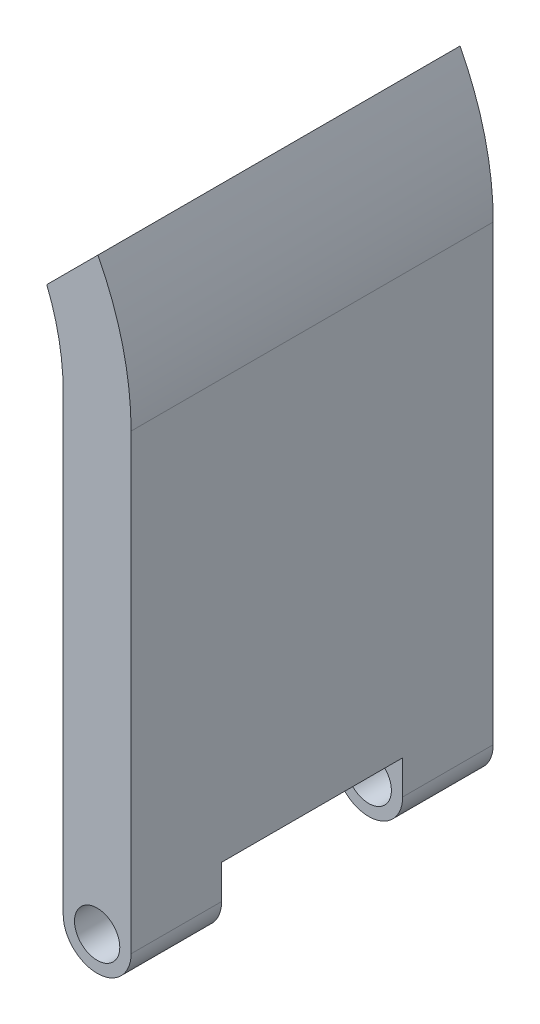
ISO-10303-21;
HEADER;
FILE_DESCRIPTION(('STEP AP214'),'2;1');
FILE_NAME('part.step','',(''),(''),'','','');
FILE_SCHEMA(('AUTOMOTIVE_DESIGN { 1 0 10303 214 1 1 1 1 }'));
ENDSEC;
DATA;
#1=APPLICATION_CONTEXT('core data for automotive mechanical design processes');
#2=APPLICATION_PROTOCOL_DEFINITION('international standard','automotive_design',2000,#1);
#3=PRODUCT_CONTEXT('',#1,'mechanical');
#4=PRODUCT('Part','Part','',(#3));
#5=PRODUCT_RELATED_PRODUCT_CATEGORY('part','',(#4));
#6=PRODUCT_DEFINITION_FORMATION('','',#4);
#7=PRODUCT_DEFINITION_CONTEXT('part definition',#1,'design');
#8=PRODUCT_DEFINITION('design','',#6,#7);
#9=PRODUCT_DEFINITION_SHAPE('','',#8);
#10=(LENGTH_UNIT() NAMED_UNIT(*) SI_UNIT(.MILLI.,.METRE.));
#11=(NAMED_UNIT(*) PLANE_ANGLE_UNIT() SI_UNIT($,.RADIAN.));
#12=(NAMED_UNIT(*) SI_UNIT($,.STERADIAN.) SOLID_ANGLE_UNIT());
#13=UNCERTAINTY_MEASURE_WITH_UNIT(LENGTH_MEASURE(1.E-05),#10,'distance_accuracy_value','');
#14=(GEOMETRIC_REPRESENTATION_CONTEXT(3) GLOBAL_UNCERTAINTY_ASSIGNED_CONTEXT((#13)) GLOBAL_UNIT_ASSIGNED_CONTEXT((#10,
#11,#12)) REPRESENTATION_CONTEXT('',''));
#15=CARTESIAN_POINT('',(0.,0.,0.));
#16=DIRECTION('',(0.,0.,1.));
#17=DIRECTION('',(1.,0.,0.));
#18=AXIS2_PLACEMENT_3D('',#15,#16,#17);
#19=CARTESIAN_POINT('',(-1.5,0.,16.));
#20=DIRECTION('',(0.,0.,-1.));
#21=DIRECTION('',(-1.,0.,0.));
#22=AXIS2_PLACEMENT_3D('',#19,#20,#21);
#23=CYLINDRICAL_SURFACE('',#22,1.5);
#24=CARTESIAN_POINT('',(-1.5,0.,12.));
#25=DIRECTION('',(0.,0.,-1.));
#26=DIRECTION('',(-1.,0.,0.));
#27=AXIS2_PLACEMENT_3D('',#24,#25,#26);
#28=CIRCLE('',#27,1.5);
#29=CARTESIAN_POINT('',(0.,0.,12.));
#30=VERTEX_POINT('',#29);
#31=CARTESIAN_POINT('',(-3.,0.,12.));
#32=VERTEX_POINT('',#31);
#33=EDGE_CURVE('E226',#30,#32,#28,.T.);
#34=ORIENTED_EDGE('',*,*,#33,.F.);
#35=DIRECTION('',(0.,0.,-1.));
#36=VECTOR('',#35,1.);
#37=CARTESIAN_POINT('',(0.,0.,16.));
#38=LINE('',#37,#36);
#39=CARTESIAN_POINT('',(0.,0.,16.));
#40=VERTEX_POINT('',#39);
#41=EDGE_CURVE('E164',#40,#30,#38,.T.);
#42=ORIENTED_EDGE('',*,*,#41,.F.);
#43=CARTESIAN_POINT('',(-1.5,0.,16.));
#44=DIRECTION('',(0.,0.,1.));
#45=DIRECTION('',(1.,0.,0.));
#46=AXIS2_PLACEMENT_3D('',#43,#44,#45);
#47=CIRCLE('',#46,1.5);
#48=CARTESIAN_POINT('',(-3.,0.,16.));
#49=VERTEX_POINT('',#48);
#50=EDGE_CURVE('E209',#49,#40,#47,.T.);
#51=ORIENTED_EDGE('',*,*,#50,.F.);
#52=DIRECTION('',(0.,0.,-1.));
#53=VECTOR('',#52,1.);
#54=CARTESIAN_POINT('',(-3.,0.,16.));
#55=LINE('',#54,#53);
#56=EDGE_CURVE('E160',#49,#32,#55,.T.);
#57=ORIENTED_EDGE('',*,*,#56,.T.);
#58=EDGE_LOOP('',(#34,#42,#51,#57));
#59=FACE_BOUND('',#58,.T.);
#60=ADVANCED_FACE('F43',(#59),#23,.T.);
#61=CARTESIAN_POINT('',(-1.5,0.,16.));
#62=DIRECTION('',(0.,0.,-1.));
#63=DIRECTION('',(-1.,0.,0.));
#64=AXIS2_PLACEMENT_3D('',#61,#62,#63);
#65=CYLINDRICAL_SURFACE('',#64,1.);
#66=CARTESIAN_POINT('',(-1.5,0.,16.));
#67=DIRECTION('',(0.,0.,1.));
#68=DIRECTION('',(1.,0.,0.));
#69=AXIS2_PLACEMENT_3D('',#66,#67,#68);
#70=CIRCLE('',#69,1.);
#71=CARTESIAN_POINT('',(-0.5,0.,16.));
#72=VERTEX_POINT('',#71);
#73=EDGE_CURVE('E181',#72,#72,#70,.T.);
#74=ORIENTED_EDGE('',*,*,#73,.T.);
#75=EDGE_LOOP('',(#74));
#76=FACE_BOUND('',#75,.T.);
#77=CARTESIAN_POINT('',(-1.5,0.,12.));
#78=DIRECTION('',(0.,0.,-1.));
#79=DIRECTION('',(-1.,0.,0.));
#80=AXIS2_PLACEMENT_3D('',#77,#78,#79);
#81=CIRCLE('',#80,1.);
#82=CARTESIAN_POINT('',(-2.5,0.,12.));
#83=VERTEX_POINT('',#82);
#84=EDGE_CURVE('E220',#83,#83,#81,.T.);
#85=ORIENTED_EDGE('',*,*,#84,.T.);
#86=EDGE_LOOP('',(#85));
#87=FACE_BOUND('',#86,.T.);
#88=ADVANCED_FACE('F272',(#76,#87),#65,.F.);
#89=CARTESIAN_POINT('',(-3.,0.,16.));
#90=DIRECTION('',(-1.,0.,0.));
#91=DIRECTION('',(0.,0.,1.));
#92=AXIS2_PLACEMENT_3D('',#89,#90,#91);
#93=PLANE('',#92);
#94=DIRECTION('',(0.,-1.,0.));
#95=VECTOR('',#94,1.);
#96=CARTESIAN_POINT('',(-3.,0.,4.));
#97=LINE('',#96,#95);
#98=CARTESIAN_POINT('',(-3.,1.5,4.));
#99=VERTEX_POINT('',#98);
#100=CARTESIAN_POINT('',(-3.,0.,4.));
#101=VERTEX_POINT('',#100);
#102=EDGE_CURVE('E234',#99,#101,#97,.T.);
#103=ORIENTED_EDGE('',*,*,#102,.F.);
#104=DIRECTION('',(0.,0.,1.));
#105=VECTOR('',#104,1.);
#106=CARTESIAN_POINT('',(-3.,1.5,4.));
#107=LINE('',#106,#105);
#108=CARTESIAN_POINT('',(-3.,1.5,12.));
#109=VERTEX_POINT('',#108);
#110=EDGE_CURVE('E148',#99,#109,#107,.T.);
#111=ORIENTED_EDGE('',*,*,#110,.T.);
#112=DIRECTION('',(0.,-1.,0.));
#113=VECTOR('',#112,1.);
#114=CARTESIAN_POINT('',(-3.,0.,12.));
#115=LINE('',#114,#113);
#116=EDGE_CURVE('E223',#109,#32,#115,.T.);
#117=ORIENTED_EDGE('',*,*,#116,.T.);
#118=ORIENTED_EDGE('',*,*,#56,.F.);
#119=DIRECTION('',(0.,1.,0.));
#120=VECTOR('',#119,1.);
#121=CARTESIAN_POINT('',(-3.,0.,16.));
#122=LINE('',#121,#120);
#123=CARTESIAN_POINT('',(-3.,20.,16.));
#124=VERTEX_POINT('',#123);
#125=EDGE_CURVE('E212',#49,#124,#122,.T.);
#126=ORIENTED_EDGE('',*,*,#125,.T.);
#127=DIRECTION('',(0.,0.,-1.));
#128=VECTOR('',#127,1.);
#129=CARTESIAN_POINT('',(-3.,20.,16.));
#130=LINE('',#129,#128);
#131=CARTESIAN_POINT('',(-3.,20.,0.));
#132=VERTEX_POINT('',#131);
#133=EDGE_CURVE('E175',#124,#132,#130,.T.);
#134=ORIENTED_EDGE('',*,*,#133,.T.);
#135=DIRECTION('',(0.,1.,0.));
#136=VECTOR('',#135,1.);
#137=CARTESIAN_POINT('',(-3.,0.,0.));
#138=LINE('',#137,#136);
#139=CARTESIAN_POINT('',(-3.,0.,0.));
#140=VERTEX_POINT('',#139);
#141=EDGE_CURVE('E194',#140,#132,#138,.T.);
#142=ORIENTED_EDGE('',*,*,#141,.F.);
#143=EDGE_CURVE('E163',#101,#140,#55,.T.);
#144=ORIENTED_EDGE('',*,*,#143,.F.);
#145=EDGE_LOOP('',(#103,#111,#117,#118,#126,#134,#142,#144));
#146=FACE_BOUND('',#145,.T.);
#147=ADVANCED_FACE('F244',(#146),#93,.T.);
#148=CARTESIAN_POINT('',(0.,0.,4.));
#149=VERTEX_POINT('',#148);
#150=CARTESIAN_POINT('',(0.,0.,0.));
#151=VERTEX_POINT('',#150);
#152=EDGE_CURVE('E166',#149,#151,#38,.T.);
#153=ORIENTED_EDGE('',*,*,#152,.F.);
#154=CARTESIAN_POINT('',(-1.5,0.,4.));
#155=DIRECTION('',(0.,0.,-1.));
#156=DIRECTION('',(-1.,0.,0.));
#157=AXIS2_PLACEMENT_3D('',#154,#155,#156);
#158=CIRCLE('',#157,1.5);
#159=EDGE_CURVE('E135',#149,#101,#158,.T.);
#160=ORIENTED_EDGE('',*,*,#159,.T.);
#161=ORIENTED_EDGE('',*,*,#143,.T.);
#162=CARTESIAN_POINT('',(-1.5,0.,0.));
#163=DIRECTION('',(0.,0.,1.));
#164=DIRECTION('',(1.,0.,0.));
#165=AXIS2_PLACEMENT_3D('',#162,#163,#164);
#166=CIRCLE('',#165,1.5);
#167=EDGE_CURVE('E191',#140,#151,#166,.T.);
#168=ORIENTED_EDGE('',*,*,#167,.T.);
#169=EDGE_LOOP('',(#153,#160,#161,#168));
#170=FACE_BOUND('',#169,.T.);
#171=ADVANCED_FACE('F248',(#170),#23,.T.);
#172=CARTESIAN_POINT('',(0.,0.,16.));
#173=DIRECTION('',(-1.,0.,0.));
#174=DIRECTION('',(0.,0.,1.));
#175=AXIS2_PLACEMENT_3D('',#172,#173,#174);
#176=PLANE('',#175);
#177=DIRECTION('',(0.,0.,1.));
#178=VECTOR('',#177,1.);
#179=CARTESIAN_POINT('',(0.,1.5,4.));
#180=LINE('',#179,#178);
#181=CARTESIAN_POINT('',(0.,1.5,4.));
#182=VERTEX_POINT('',#181);
#183=CARTESIAN_POINT('',(0.,1.5,12.));
#184=VERTEX_POINT('',#183);
#185=EDGE_CURVE('E142',#182,#184,#180,.T.);
#186=ORIENTED_EDGE('',*,*,#185,.F.);
#187=DIRECTION('',(0.,1.,0.));
#188=VECTOR('',#187,1.);
#189=CARTESIAN_POINT('',(0.,0.,4.));
#190=LINE('',#189,#188);
#191=EDGE_CURVE('E130',#149,#182,#190,.T.);
#192=ORIENTED_EDGE('',*,*,#191,.F.);
#193=ORIENTED_EDGE('',*,*,#152,.T.);
#194=DIRECTION('',(0.,1.,0.));
#195=VECTOR('',#194,1.);
#196=CARTESIAN_POINT('',(0.,0.,0.));
#197=LINE('',#196,#195);
#198=CARTESIAN_POINT('',(0.,20.,0.));
#199=VERTEX_POINT('',#198);
#200=EDGE_CURVE('E188',#151,#199,#197,.T.);
#201=ORIENTED_EDGE('',*,*,#200,.T.);
#202=DIRECTION('',(0.,0.,-1.));
#203=VECTOR('',#202,1.);
#204=CARTESIAN_POINT('',(0.,20.,16.));
#205=LINE('',#204,#203);
#206=CARTESIAN_POINT('',(0.,20.,16.));
#207=VERTEX_POINT('',#206);
#208=EDGE_CURVE('E167',#207,#199,#205,.T.);
#209=ORIENTED_EDGE('',*,*,#208,.F.);
#210=DIRECTION('',(0.,1.,0.));
#211=VECTOR('',#210,1.);
#212=CARTESIAN_POINT('',(0.,0.,16.));
#213=LINE('',#212,#211);
#214=EDGE_CURVE('E206',#40,#207,#213,.T.);
#215=ORIENTED_EDGE('',*,*,#214,.F.);
#216=ORIENTED_EDGE('',*,*,#41,.T.);
#217=DIRECTION('',(0.,1.,0.));
#218=VECTOR('',#217,1.);
#219=CARTESIAN_POINT('',(0.,0.,12.));
#220=LINE('',#219,#218);
#221=EDGE_CURVE('E145',#30,#184,#220,.T.);
#222=ORIENTED_EDGE('',*,*,#221,.T.);
#223=EDGE_LOOP('',(#186,#192,#193,#201,#209,#215,#216,#222));
#224=FACE_BOUND('',#223,.T.);
#225=ADVANCED_FACE('F143',(#224),#176,.F.);
#226=CARTESIAN_POINT('',(-13.,20.,16.));
#227=DIRECTION('',(0.,0.,-1.));
#228=DIRECTION('',(-1.,0.,0.));
#229=AXIS2_PLACEMENT_3D('',#226,#227,#228);
#230=CYLINDRICAL_SURFACE('',#229,13.);
#231=CARTESIAN_POINT('',(-13.,20.,0.));
#232=DIRECTION('',(0.,0.,1.));
#233=DIRECTION('',(1.,0.,0.));
#234=AXIS2_PLACEMENT_3D('',#231,#232,#233);
#235=CIRCLE('',#234,13.);
#236=CARTESIAN_POINT('',(-1.46743740532921,26.,0.));
#237=VERTEX_POINT('',#236);
#238=EDGE_CURVE('E185',#199,#237,#235,.T.);
#239=ORIENTED_EDGE('',*,*,#238,.T.);
#240=DIRECTION('',(0.,0.,-1.));
#241=VECTOR('',#240,1.);
#242=CARTESIAN_POINT('',(-1.46743740532921,26.,16.));
#243=LINE('',#242,#241);
#244=CARTESIAN_POINT('',(-1.46743740532921,26.,16.));
#245=VERTEX_POINT('',#244);
#246=EDGE_CURVE('E170',#245,#237,#243,.T.);
#247=ORIENTED_EDGE('',*,*,#246,.F.);
#248=CARTESIAN_POINT('',(-13.,20.,16.));
#249=DIRECTION('',(0.,0.,1.));
#250=DIRECTION('',(1.,0.,0.));
#251=AXIS2_PLACEMENT_3D('',#248,#249,#250);
#252=CIRCLE('',#251,13.);
#253=EDGE_CURVE('E203',#207,#245,#252,.T.);
#254=ORIENTED_EDGE('',*,*,#253,.F.);
#255=ORIENTED_EDGE('',*,*,#208,.T.);
#256=EDGE_LOOP('',(#239,#247,#254,#255));
#257=FACE_BOUND('',#256,.T.);
#258=ADVANCED_FACE('F256',(#257),#230,.T.);
#259=CARTESIAN_POINT('',(-13.7337187026646,13.7337187026646,16.));
#260=DIRECTION('',(0.707106781186549,-0.707106781186546,0.));
#261=DIRECTION('',(0.707106781186546,0.707106781186549,0.));
#262=AXIS2_PLACEMENT_3D('',#259,#260,#261);
#263=PLANE('',#262);
#264=DIRECTION('',(-0.707106781186546,-0.707106781186549,0.));
#265=VECTOR('',#264,1.);
#266=CARTESIAN_POINT('',(-13.7337187026646,13.7337187026646,0.));
#267=LINE('',#266,#265);
#268=CARTESIAN_POINT('',(-3.72620859633266,23.7412288089965,0.));
#269=VERTEX_POINT('',#268);
#270=EDGE_CURVE('E182',#237,#269,#267,.T.);
#271=ORIENTED_EDGE('',*,*,#270,.T.);
#272=DIRECTION('',(0.,0.,-1.));
#273=VECTOR('',#272,1.);
#274=CARTESIAN_POINT('',(-3.72620859633266,23.7412288089965,16.));
#275=LINE('',#274,#273);
#276=CARTESIAN_POINT('',(-3.72620859633266,23.7412288089965,16.));
#277=VERTEX_POINT('',#276);
#278=EDGE_CURVE('E173',#277,#269,#275,.T.);
#279=ORIENTED_EDGE('',*,*,#278,.F.);
#280=DIRECTION('',(-0.707106781186546,-0.707106781186549,0.));
#281=VECTOR('',#280,1.);
#282=CARTESIAN_POINT('',(-13.7337187026646,13.7337187026646,16.));
#283=LINE('',#282,#281);
#284=EDGE_CURVE('E201',#245,#277,#283,.T.);
#285=ORIENTED_EDGE('',*,*,#284,.F.);
#286=ORIENTED_EDGE('',*,*,#246,.T.);
#287=EDGE_LOOP('',(#271,#279,#285,#286));
#288=FACE_BOUND('',#287,.T.);
#289=ADVANCED_FACE('F286',(#288),#263,.F.);
#290=CARTESIAN_POINT('',(-1.5,0.,4.));
#291=DIRECTION('',(0.,0.,-1.));
#292=DIRECTION('',(-1.,0.,0.));
#293=AXIS2_PLACEMENT_3D('',#290,#291,#292);
#294=CIRCLE('',#293,1.);
#295=CARTESIAN_POINT('',(-2.5,0.,4.));
#296=VERTEX_POINT('',#295);
#297=EDGE_CURVE('E219',#296,#296,#294,.T.);
#298=ORIENTED_EDGE('',*,*,#297,.F.);
#299=EDGE_LOOP('',(#298));
#300=FACE_BOUND('',#299,.T.);
#301=CARTESIAN_POINT('',(-1.5,0.,0.));
#302=DIRECTION('',(0.,0.,1.));
#303=DIRECTION('',(1.,0.,0.));
#304=AXIS2_PLACEMENT_3D('',#301,#302,#303);
#305=CIRCLE('',#304,1.);
#306=CARTESIAN_POINT('',(-0.5,0.,0.));
#307=VERTEX_POINT('',#306);
#308=EDGE_CURVE('E147',#307,#307,#305,.T.);
#309=ORIENTED_EDGE('',*,*,#308,.F.);
#310=EDGE_LOOP('',(#309));
#311=FACE_BOUND('',#310,.T.);
#312=ADVANCED_FACE('F276',(#300,#311),#65,.F.);
#313=CARTESIAN_POINT('',(-13.,20.,16.));
#314=DIRECTION('',(0.,0.,-1.));
#315=DIRECTION('',(-1.,0.,0.));
#316=AXIS2_PLACEMENT_3D('',#313,#314,#315);
#317=CYLINDRICAL_SURFACE('',#316,10.);
#318=CARTESIAN_POINT('',(-13.,20.,0.));
#319=DIRECTION('',(0.,0.,1.));
#320=DIRECTION('',(1.,0.,0.));
#321=AXIS2_PLACEMENT_3D('',#318,#319,#320);
#322=CIRCLE('',#321,10.);
#323=EDGE_CURVE('E178',#132,#269,#322,.T.);
#324=ORIENTED_EDGE('',*,*,#323,.F.);
#325=ORIENTED_EDGE('',*,*,#133,.F.);
#326=CARTESIAN_POINT('',(-13.,20.,16.));
#327=DIRECTION('',(0.,0.,1.));
#328=DIRECTION('',(1.,0.,0.));
#329=AXIS2_PLACEMENT_3D('',#326,#327,#328);
#330=CIRCLE('',#329,10.);
#331=EDGE_CURVE('E177',#124,#277,#330,.T.);
#332=ORIENTED_EDGE('',*,*,#331,.T.);
#333=ORIENTED_EDGE('',*,*,#278,.T.);
#334=EDGE_LOOP('',(#324,#325,#332,#333));
#335=FACE_BOUND('',#334,.T.);
#336=ADVANCED_FACE('F285',(#335),#317,.F.);
#337=CARTESIAN_POINT('',(0.,0.,16.));
#338=DIRECTION('',(0.,0.,1.));
#339=DIRECTION('',(1.,0.,0.));
#340=AXIS2_PLACEMENT_3D('',#337,#338,#339);
#341=PLANE('',#340);
#342=ORIENTED_EDGE('',*,*,#73,.F.);
#343=EDGE_LOOP('',(#342));
#344=FACE_BOUND('',#343,.T.);
#345=ORIENTED_EDGE('',*,*,#125,.F.);
#346=ORIENTED_EDGE('',*,*,#50,.T.);
#347=ORIENTED_EDGE('',*,*,#214,.T.);
#348=ORIENTED_EDGE('',*,*,#253,.T.);
#349=ORIENTED_EDGE('',*,*,#284,.T.);
#350=ORIENTED_EDGE('',*,*,#331,.F.);
#351=EDGE_LOOP('',(#345,#346,#347,#348,#349,#350));
#352=FACE_BOUND('',#351,.T.);
#353=ADVANCED_FACE('F261',(#344,#352),#341,.T.);
#354=CARTESIAN_POINT('',(0.,0.,0.));
#355=DIRECTION('',(0.,0.,1.));
#356=DIRECTION('',(1.,0.,0.));
#357=AXIS2_PLACEMENT_3D('',#354,#355,#356);
#358=PLANE('',#357);
#359=ORIENTED_EDGE('',*,*,#308,.T.);
#360=EDGE_LOOP('',(#359));
#361=FACE_BOUND('',#360,.T.);
#362=ORIENTED_EDGE('',*,*,#141,.T.);
#363=ORIENTED_EDGE('',*,*,#323,.T.);
#364=ORIENTED_EDGE('',*,*,#270,.F.);
#365=ORIENTED_EDGE('',*,*,#238,.F.);
#366=ORIENTED_EDGE('',*,*,#200,.F.);
#367=ORIENTED_EDGE('',*,*,#167,.F.);
#368=EDGE_LOOP('',(#362,#363,#364,#365,#366,#367));
#369=FACE_BOUND('',#368,.T.);
#370=ADVANCED_FACE('F253',(#361,#369),#358,.F.);
#371=CARTESIAN_POINT('',(-1.5,1.5,4.));
#372=DIRECTION('',(0.,0.,1.));
#373=DIRECTION('',(1.,0.,0.));
#374=AXIS2_PLACEMENT_3D('',#371,#372,#373);
#375=CYLINDRICAL_SURFACE('',#374,0.5);
#376=CARTESIAN_POINT('',(-1.5,1.5,4.));
#377=DIRECTION('',(0.,0.,-1.));
#378=DIRECTION('',(-1.,0.,0.));
#379=AXIS2_PLACEMENT_3D('',#376,#377,#378);
#380=CIRCLE('',#379,0.5);
#381=CARTESIAN_POINT('',(-1.6984126984127,1.95894705697781,4.));
#382=VERTEX_POINT('',#381);
#383=CARTESIAN_POINT('',(-1.3015873015873,1.95894705697781,4.));
#384=VERTEX_POINT('',#383);
#385=EDGE_CURVE('E138',#382,#384,#380,.T.);
#386=ORIENTED_EDGE('',*,*,#385,.T.);
#387=DIRECTION('',(0.,0.,1.));
#388=VECTOR('',#387,1.);
#389=CARTESIAN_POINT('',(-1.3015873015873,1.95894705697781,4.));
#390=LINE('',#389,#388);
#391=CARTESIAN_POINT('',(-1.3015873015873,1.95894705697781,12.));
#392=VERTEX_POINT('',#391);
#393=EDGE_CURVE('E153',#384,#392,#390,.T.);
#394=ORIENTED_EDGE('',*,*,#393,.T.);
#395=CARTESIAN_POINT('',(-1.5,1.5,12.));
#396=DIRECTION('',(0.,0.,-1.));
#397=DIRECTION('',(-1.,0.,0.));
#398=AXIS2_PLACEMENT_3D('',#395,#396,#397);
#399=CIRCLE('',#398,0.5);
#400=CARTESIAN_POINT('',(-1.6984126984127,1.95894705697781,12.));
#401=VERTEX_POINT('',#400);
#402=EDGE_CURVE('E229',#401,#392,#399,.T.);
#403=ORIENTED_EDGE('',*,*,#402,.F.);
#404=DIRECTION('',(0.,0.,1.));
#405=VECTOR('',#404,1.);
#406=CARTESIAN_POINT('',(-1.6984126984127,1.95894705697781,4.));
#407=LINE('',#406,#405);
#408=EDGE_CURVE('E65',#401,#382,#407,.F.);
#409=ORIENTED_EDGE('',*,*,#408,.T.);
#410=EDGE_LOOP('',(#386,#394,#403,#409));
#411=FACE_BOUND('',#410,.T.);
#412=ADVANCED_FACE('F237',(#411),#375,.F.);
#413=CARTESIAN_POINT('',(0.,0.,4.));
#414=DIRECTION('',(0.,0.,-1.));
#415=DIRECTION('',(-1.,0.,0.));
#416=AXIS2_PLACEMENT_3D('',#413,#414,#415);
#417=PLANE('',#416);
#418=ORIENTED_EDGE('',*,*,#385,.F.);
#419=CARTESIAN_POINT('',(-5.66666666666667,11.137888196534,4.));
#420=DIRECTION('',(0.,0.,-1.));
#421=DIRECTION('',(-1.,0.,0.));
#422=AXIS2_PLACEMENT_3D('',#419,#420,#421);
#423=CIRCLE('',#422,10.);
#424=EDGE_CURVE('E11',#382,#99,#423,.T.);
#425=ORIENTED_EDGE('',*,*,#424,.T.);
#426=ORIENTED_EDGE('',*,*,#102,.T.);
#427=ORIENTED_EDGE('',*,*,#159,.F.);
#428=ORIENTED_EDGE('',*,*,#191,.T.);
#429=CARTESIAN_POINT('',(2.66666666666667,11.137888196534,4.));
#430=DIRECTION('',(0.,0.,-1.));
#431=DIRECTION('',(-1.,0.,0.));
#432=AXIS2_PLACEMENT_3D('',#429,#430,#431);
#433=CIRCLE('',#432,10.);
#434=EDGE_CURVE('E58',#182,#384,#433,.T.);
#435=ORIENTED_EDGE('',*,*,#434,.T.);
#436=EDGE_LOOP('',(#418,#425,#426,#427,#428,#435));
#437=FACE_BOUND('',#436,.T.);
#438=ORIENTED_EDGE('',*,*,#297,.T.);
#439=EDGE_LOOP('',(#438));
#440=FACE_BOUND('',#439,.T.);
#441=ADVANCED_FACE('F132',(#437,#440),#417,.F.);
#442=CARTESIAN_POINT('',(0.,0.,12.));
#443=DIRECTION('',(0.,0.,-1.));
#444=DIRECTION('',(-1.,0.,0.));
#445=AXIS2_PLACEMENT_3D('',#442,#443,#444);
#446=PLANE('',#445);
#447=ORIENTED_EDGE('',*,*,#116,.F.);
#448=CARTESIAN_POINT('',(-5.66666666666667,11.137888196534,12.));
#449=DIRECTION('',(0.,0.,-1.));
#450=DIRECTION('',(-1.,0.,0.));
#451=AXIS2_PLACEMENT_3D('',#448,#449,#450);
#452=CIRCLE('',#451,10.);
#453=EDGE_CURVE('E51',#109,#401,#452,.F.);
#454=ORIENTED_EDGE('',*,*,#453,.T.);
#455=ORIENTED_EDGE('',*,*,#402,.T.);
#456=CARTESIAN_POINT('',(2.66666666666667,11.137888196534,12.));
#457=DIRECTION('',(0.,0.,-1.));
#458=DIRECTION('',(-1.,0.,0.));
#459=AXIS2_PLACEMENT_3D('',#456,#457,#458);
#460=CIRCLE('',#459,10.);
#461=EDGE_CURVE('E154',#392,#184,#460,.F.);
#462=ORIENTED_EDGE('',*,*,#461,.T.);
#463=ORIENTED_EDGE('',*,*,#221,.F.);
#464=ORIENTED_EDGE('',*,*,#33,.T.);
#465=EDGE_LOOP('',(#447,#454,#455,#462,#463,#464));
#466=FACE_BOUND('',#465,.T.);
#467=ORIENTED_EDGE('',*,*,#84,.F.);
#468=EDGE_LOOP('',(#467));
#469=FACE_BOUND('',#468,.T.);
#470=ADVANCED_FACE('F266',(#466,#469),#446,.T.);
#471=CARTESIAN_POINT('',(2.66666666666667,11.137888196534,4.));
#472=DIRECTION('',(0.,0.,1.));
#473=DIRECTION('',(1.,0.,0.));
#474=AXIS2_PLACEMENT_3D('',#471,#472,#473);
#475=CYLINDRICAL_SURFACE('',#474,10.);
#476=ORIENTED_EDGE('',*,*,#434,.F.);
#477=ORIENTED_EDGE('',*,*,#185,.T.);
#478=ORIENTED_EDGE('',*,*,#461,.F.);
#479=ORIENTED_EDGE('',*,*,#393,.F.);
#480=EDGE_LOOP('',(#476,#477,#478,#479));
#481=FACE_BOUND('',#480,.T.);
#482=ADVANCED_FACE('F151',(#481),#475,.T.);
#483=CARTESIAN_POINT('',(-5.66666666666667,11.137888196534,4.));
#484=DIRECTION('',(0.,0.,1.));
#485=DIRECTION('',(1.,0.,0.));
#486=AXIS2_PLACEMENT_3D('',#483,#484,#485);
#487=CYLINDRICAL_SURFACE('',#486,10.);
#488=ORIENTED_EDGE('',*,*,#424,.F.);
#489=ORIENTED_EDGE('',*,*,#408,.F.);
#490=ORIENTED_EDGE('',*,*,#453,.F.);
#491=ORIENTED_EDGE('',*,*,#110,.F.);
#492=EDGE_LOOP('',(#488,#489,#490,#491));
#493=FACE_BOUND('',#492,.T.);
#494=ADVANCED_FACE('F45',(#493),#487,.T.);
#495=CLOSED_SHELL('',(#60,#88,#147,#171,#225,#258,#289,#312,#336,#353,#370,#412,#441,#470,#482,#494));
#496=MANIFOLD_SOLID_BREP('B2',#495);
#497=ADVANCED_BREP_SHAPE_REPRESENTATION('',(#18,#496),#14);
#498=SHAPE_DEFINITION_REPRESENTATION(#9,#497);
ENDSEC;
END-ISO-10303-21;
